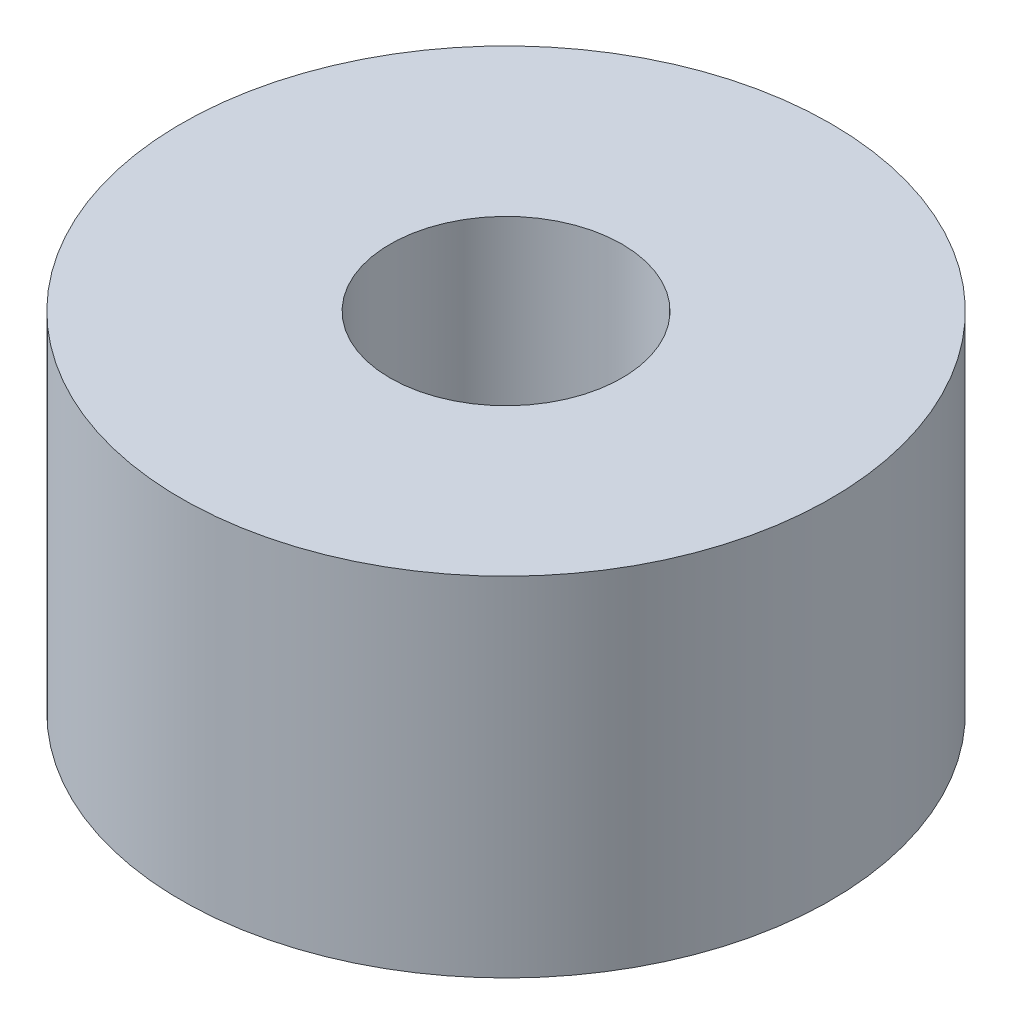
ISO-10303-21;
HEADER;
FILE_DESCRIPTION(('STEP AP214'),'2;1');
FILE_NAME('part.step','',(''),(''),'','','');
FILE_SCHEMA(('AUTOMOTIVE_DESIGN { 1 0 10303 214 1 1 1 1 }'));
ENDSEC;
DATA;
#1=APPLICATION_CONTEXT('core data for automotive mechanical design processes');
#2=APPLICATION_PROTOCOL_DEFINITION('international standard','automotive_design',2000,#1);
#3=PRODUCT_CONTEXT('',#1,'mechanical');
#4=PRODUCT('Part','Part','',(#3));
#5=PRODUCT_RELATED_PRODUCT_CATEGORY('part','',(#4));
#6=PRODUCT_DEFINITION_FORMATION('','',#4);
#7=PRODUCT_DEFINITION_CONTEXT('part definition',#1,'design');
#8=PRODUCT_DEFINITION('design','',#6,#7);
#9=PRODUCT_DEFINITION_SHAPE('','',#8);
#10=(LENGTH_UNIT() NAMED_UNIT(*) SI_UNIT(.MILLI.,.METRE.));
#11=(NAMED_UNIT(*) PLANE_ANGLE_UNIT() SI_UNIT($,.RADIAN.));
#12=(NAMED_UNIT(*) SI_UNIT($,.STERADIAN.) SOLID_ANGLE_UNIT());
#13=UNCERTAINTY_MEASURE_WITH_UNIT(LENGTH_MEASURE(1.E-05),#10,'distance_accuracy_value','');
#14=(GEOMETRIC_REPRESENTATION_CONTEXT(3) GLOBAL_UNCERTAINTY_ASSIGNED_CONTEXT((#13)) GLOBAL_UNIT_ASSIGNED_CONTEXT((#10,
#11,#12)) REPRESENTATION_CONTEXT('',''));
#15=CARTESIAN_POINT('',(0.,0.,0.));
#16=DIRECTION('',(0.,0.,1.));
#17=DIRECTION('',(1.,0.,0.));
#18=AXIS2_PLACEMENT_3D('',#15,#16,#17);
#19=CARTESIAN_POINT('',(0.,9.525,0.));
#20=DIRECTION('',(0.,1.,0.));
#21=DIRECTION('',(0.,0.,1.));
#22=AXIS2_PLACEMENT_3D('',#19,#20,#21);
#23=PLANE('',#22);
#24=CARTESIAN_POINT('',(0.,9.525,0.));
#25=DIRECTION('',(0.,1.,0.));
#26=DIRECTION('',(0.,0.,1.));
#27=AXIS2_PLACEMENT_3D('',#24,#25,#26);
#28=CIRCLE('',#27,8.89);
#29=CARTESIAN_POINT('',(0.,9.525,-8.89));
#30=VERTEX_POINT('',#29);
#31=EDGE_CURVE('E10',#30,#30,#28,.T.);
#32=ORIENTED_EDGE('',*,*,#31,.T.);
#33=EDGE_LOOP('',(#32));
#34=FACE_BOUND('',#33,.T.);
#35=CARTESIAN_POINT('',(0.,9.525,0.));
#36=DIRECTION('',(0.,1.,0.));
#37=DIRECTION('',(0.,0.,1.));
#38=AXIS2_PLACEMENT_3D('',#35,#36,#37);
#39=CIRCLE('',#38,3.175);
#40=CARTESIAN_POINT('',(0.,9.525,-3.175));
#41=VERTEX_POINT('',#40);
#42=EDGE_CURVE('E50',#41,#41,#39,.T.);
#43=ORIENTED_EDGE('',*,*,#42,.F.);
#44=EDGE_LOOP('',(#43));
#45=FACE_BOUND('',#44,.T.);
#46=ADVANCED_FACE('F37',(#34,#45),#23,.T.);
#47=CARTESIAN_POINT('',(0.,0.,0.));
#48=DIRECTION('',(0.,1.,0.));
#49=DIRECTION('',(0.,0.,1.));
#50=AXIS2_PLACEMENT_3D('',#47,#48,#49);
#51=PLANE('',#50);
#52=CARTESIAN_POINT('',(0.,0.,0.));
#53=DIRECTION('',(0.,1.,0.));
#54=DIRECTION('',(0.,0.,1.));
#55=AXIS2_PLACEMENT_3D('',#52,#53,#54);
#56=CIRCLE('',#55,8.89);
#57=CARTESIAN_POINT('',(0.,0.,-8.89));
#58=VERTEX_POINT('',#57);
#59=EDGE_CURVE('E41',#58,#58,#56,.T.);
#60=ORIENTED_EDGE('',*,*,#59,.F.);
#61=EDGE_LOOP('',(#60));
#62=FACE_BOUND('',#61,.T.);
#63=CARTESIAN_POINT('',(0.,0.,0.));
#64=DIRECTION('',(0.,1.,0.));
#65=DIRECTION('',(0.,0.,1.));
#66=AXIS2_PLACEMENT_3D('',#63,#64,#65);
#67=CIRCLE('',#66,3.175);
#68=CARTESIAN_POINT('',(0.,0.,-3.175));
#69=VERTEX_POINT('',#68);
#70=EDGE_CURVE('E52',#69,#69,#67,.T.);
#71=ORIENTED_EDGE('',*,*,#70,.T.);
#72=EDGE_LOOP('',(#71));
#73=FACE_BOUND('',#72,.T.);
#74=ADVANCED_FACE('F64',(#62,#73),#51,.F.);
#75=CARTESIAN_POINT('',(0.,9.525,0.));
#76=DIRECTION('',(0.,-1.,0.));
#77=DIRECTION('',(0.,0.,-1.));
#78=AXIS2_PLACEMENT_3D('',#75,#76,#77);
#79=CYLINDRICAL_SURFACE('',#78,8.89);
#80=CARTESIAN_POINT('',(0.,9.525,-8.89));
#81=CARTESIAN_POINT('',(0.,9.42578125,-8.89));
#82=CARTESIAN_POINT('',(0.,9.3265625,-8.89));
#83=CARTESIAN_POINT('',(0.,9.128125,-8.89));
#84=CARTESIAN_POINT('',(0.,9.02890625,-8.89));
#85=CARTESIAN_POINT('',(0.,8.83046875,-8.89));
#86=CARTESIAN_POINT('',(0.,8.73125,-8.89));
#87=CARTESIAN_POINT('',(0.,8.5328125,-8.89));
#88=CARTESIAN_POINT('',(0.,8.43359375,-8.89));
#89=CARTESIAN_POINT('',(0.,8.23515625,-8.89));
#90=CARTESIAN_POINT('',(0.,8.1359375,-8.89));
#91=CARTESIAN_POINT('',(0.,7.9375,-8.89));
#92=CARTESIAN_POINT('',(0.,7.83828125,-8.89));
#93=CARTESIAN_POINT('',(0.,7.63984375,-8.89));
#94=CARTESIAN_POINT('',(0.,7.540625,-8.89));
#95=CARTESIAN_POINT('',(0.,7.3421875,-8.89));
#96=CARTESIAN_POINT('',(0.,7.24296875,-8.89));
#97=CARTESIAN_POINT('',(0.,7.04453125,-8.89));
#98=CARTESIAN_POINT('',(0.,6.9453125,-8.89));
#99=CARTESIAN_POINT('',(0.,6.746875,-8.89));
#100=CARTESIAN_POINT('',(0.,6.64765625,-8.89));
#101=CARTESIAN_POINT('',(0.,6.44921875,-8.89));
#102=CARTESIAN_POINT('',(0.,6.35,-8.89));
#103=CARTESIAN_POINT('',(0.,6.1515625,-8.89));
#104=CARTESIAN_POINT('',(0.,6.05234375,-8.89));
#105=CARTESIAN_POINT('',(0.,5.85390625,-8.89));
#106=CARTESIAN_POINT('',(0.,5.7546875,-8.89));
#107=CARTESIAN_POINT('',(0.,5.55625,-8.89));
#108=CARTESIAN_POINT('',(0.,5.45703125,-8.89));
#109=CARTESIAN_POINT('',(0.,5.25859375,-8.89));
#110=CARTESIAN_POINT('',(0.,5.159375,-8.89));
#111=CARTESIAN_POINT('',(0.,4.9609375,-8.89));
#112=CARTESIAN_POINT('',(0.,4.86171875,-8.89));
#113=CARTESIAN_POINT('',(0.,4.66328125,-8.89));
#114=CARTESIAN_POINT('',(0.,4.5640625,-8.89));
#115=CARTESIAN_POINT('',(0.,4.365625,-8.89));
#116=CARTESIAN_POINT('',(0.,4.26640625,-8.89));
#117=CARTESIAN_POINT('',(0.,4.06796875,-8.89));
#118=CARTESIAN_POINT('',(0.,3.96875,-8.89));
#119=CARTESIAN_POINT('',(0.,3.7703125,-8.89));
#120=CARTESIAN_POINT('',(0.,3.67109375,-8.89));
#121=CARTESIAN_POINT('',(0.,3.47265625,-8.89));
#122=CARTESIAN_POINT('',(0.,3.3734375,-8.89));
#123=CARTESIAN_POINT('',(0.,3.175,-8.89));
#124=CARTESIAN_POINT('',(0.,3.07578125,-8.89));
#125=CARTESIAN_POINT('',(0.,2.87734375,-8.89));
#126=CARTESIAN_POINT('',(0.,2.778125,-8.89));
#127=CARTESIAN_POINT('',(0.,2.5796875,-8.89));
#128=CARTESIAN_POINT('',(0.,2.48046875,-8.89));
#129=CARTESIAN_POINT('',(0.,2.28203125,-8.89));
#130=CARTESIAN_POINT('',(0.,2.1828125,-8.89));
#131=CARTESIAN_POINT('',(0.,1.984375,-8.89));
#132=CARTESIAN_POINT('',(0.,1.88515625,-8.89));
#133=CARTESIAN_POINT('',(0.,1.68671875,-8.89));
#134=CARTESIAN_POINT('',(0.,1.5875,-8.89));
#135=CARTESIAN_POINT('',(0.,1.3890625,-8.89));
#136=CARTESIAN_POINT('',(0.,1.28984375,-8.89));
#137=CARTESIAN_POINT('',(0.,1.09140625,-8.89));
#138=CARTESIAN_POINT('',(0.,0.992187500000001,-8.89));
#139=CARTESIAN_POINT('',(0.,0.793750000000001,-8.89));
#140=CARTESIAN_POINT('',(0.,0.69453125,-8.89));
#141=CARTESIAN_POINT('',(0.,0.49609375,-8.89));
#142=CARTESIAN_POINT('',(0.,0.396875,-8.89));
#143=CARTESIAN_POINT('',(0.,0.1984375,-8.89));
#144=CARTESIAN_POINT('',(0.,0.0992187500000001,-8.89));
#145=CARTESIAN_POINT('',(0.,0.,-8.89));
#146=B_SPLINE_CURVE_WITH_KNOTS('',3,(#80,#81,#82,#83,#84,#85,#86,#87,#88,#89,#90,#91,#92,#93,
#94,#95,#96,#97,#98,#99,#100,#101,#102,#103,#104,#105,#106,#107,#108,#109,#110,#111,#112,#113,
#114,#115,#116,#117,#118,#119,#120,#121,#122,#123,#124,#125,#126,#127,#128,#129,#130,#131,#132,
#133,#134,#135,#136,#137,#138,#139,#140,#141,#142,#143,#144,#145),.UNSPECIFIED.,.F.,.F.,(4,2,2,
2,2,2,2,2,2,2,2,2,2,2,2,2,2,2,2,2,2,2,2,2,2,2,2,2,2,2,2,2,4),(0.,0.297656249999998,
0.595312499999999,0.892968749999999,1.190625,1.48828125,1.7859375,2.08359375,2.38125,2.67890625,
2.9765625,3.27421875,3.571875,3.86953125,4.1671875,4.46484375,4.7625,5.06015625,5.3578125,
5.65546875,5.953125,6.25078125,6.5484375,6.84609375,7.14375,7.44140625,7.7390625,8.03671875,
8.334375,8.63203125,8.9296875,9.22734375,9.525),.UNSPECIFIED.);
#147=EDGE_CURVE('BSEAM39',#30,#58,#146,.T.);
#148=ORIENTED_EDGE('',*,*,#31,.F.);
#149=ORIENTED_EDGE('',*,*,#59,.T.);
#150=ORIENTED_EDGE('',*,*,#147,.T.);
#151=ORIENTED_EDGE('',*,*,#147,.F.);
#152=EDGE_LOOP('',(#148,#150,#149,#151));
#153=FACE_BOUND('',#152,.T.);
#154=ADVANCED_FACE('F39',(#153),#79,.T.);
#155=CARTESIAN_POINT('',(0.,9.525,0.));
#156=DIRECTION('',(0.,-1.,0.));
#157=DIRECTION('',(0.,0.,-1.));
#158=AXIS2_PLACEMENT_3D('',#155,#156,#157);
#159=CYLINDRICAL_SURFACE('',#158,3.175);
#160=CARTESIAN_POINT('',(0.,9.525,-3.175));
#161=CARTESIAN_POINT('',(0.,9.42578125,-3.175));
#162=CARTESIAN_POINT('',(0.,9.3265625,-3.175));
#163=CARTESIAN_POINT('',(0.,9.128125,-3.175));
#164=CARTESIAN_POINT('',(0.,9.02890625,-3.175));
#165=CARTESIAN_POINT('',(0.,8.83046875,-3.175));
#166=CARTESIAN_POINT('',(0.,8.73125,-3.175));
#167=CARTESIAN_POINT('',(0.,8.5328125,-3.175));
#168=CARTESIAN_POINT('',(0.,8.43359375,-3.175));
#169=CARTESIAN_POINT('',(0.,8.23515625,-3.175));
#170=CARTESIAN_POINT('',(0.,8.1359375,-3.175));
#171=CARTESIAN_POINT('',(0.,7.9375,-3.175));
#172=CARTESIAN_POINT('',(0.,7.83828125,-3.175));
#173=CARTESIAN_POINT('',(0.,7.63984375,-3.175));
#174=CARTESIAN_POINT('',(0.,7.540625,-3.175));
#175=CARTESIAN_POINT('',(0.,7.3421875,-3.175));
#176=CARTESIAN_POINT('',(0.,7.24296875,-3.175));
#177=CARTESIAN_POINT('',(0.,7.04453125,-3.175));
#178=CARTESIAN_POINT('',(0.,6.9453125,-3.175));
#179=CARTESIAN_POINT('',(0.,6.746875,-3.175));
#180=CARTESIAN_POINT('',(0.,6.64765625,-3.175));
#181=CARTESIAN_POINT('',(0.,6.44921875,-3.175));
#182=CARTESIAN_POINT('',(0.,6.35,-3.175));
#183=CARTESIAN_POINT('',(0.,6.1515625,-3.175));
#184=CARTESIAN_POINT('',(0.,6.05234375,-3.175));
#185=CARTESIAN_POINT('',(0.,5.85390625,-3.175));
#186=CARTESIAN_POINT('',(0.,5.7546875,-3.175));
#187=CARTESIAN_POINT('',(0.,5.55625,-3.175));
#188=CARTESIAN_POINT('',(0.,5.45703125,-3.175));
#189=CARTESIAN_POINT('',(0.,5.25859375,-3.175));
#190=CARTESIAN_POINT('',(0.,5.159375,-3.175));
#191=CARTESIAN_POINT('',(0.,4.9609375,-3.175));
#192=CARTESIAN_POINT('',(0.,4.86171875,-3.175));
#193=CARTESIAN_POINT('',(0.,4.66328125,-3.175));
#194=CARTESIAN_POINT('',(0.,4.5640625,-3.175));
#195=CARTESIAN_POINT('',(0.,4.365625,-3.175));
#196=CARTESIAN_POINT('',(0.,4.26640625,-3.175));
#197=CARTESIAN_POINT('',(0.,4.06796875,-3.175));
#198=CARTESIAN_POINT('',(0.,3.96875,-3.175));
#199=CARTESIAN_POINT('',(0.,3.7703125,-3.175));
#200=CARTESIAN_POINT('',(0.,3.67109375,-3.175));
#201=CARTESIAN_POINT('',(0.,3.47265625,-3.175));
#202=CARTESIAN_POINT('',(0.,3.3734375,-3.175));
#203=CARTESIAN_POINT('',(0.,3.175,-3.175));
#204=CARTESIAN_POINT('',(0.,3.07578125,-3.175));
#205=CARTESIAN_POINT('',(0.,2.87734375,-3.175));
#206=CARTESIAN_POINT('',(0.,2.778125,-3.175));
#207=CARTESIAN_POINT('',(0.,2.5796875,-3.175));
#208=CARTESIAN_POINT('',(0.,2.48046875,-3.175));
#209=CARTESIAN_POINT('',(0.,2.28203125,-3.175));
#210=CARTESIAN_POINT('',(0.,2.1828125,-3.175));
#211=CARTESIAN_POINT('',(0.,1.984375,-3.175));
#212=CARTESIAN_POINT('',(0.,1.88515625,-3.175));
#213=CARTESIAN_POINT('',(0.,1.68671875,-3.175));
#214=CARTESIAN_POINT('',(0.,1.5875,-3.175));
#215=CARTESIAN_POINT('',(0.,1.3890625,-3.175));
#216=CARTESIAN_POINT('',(0.,1.28984375,-3.175));
#217=CARTESIAN_POINT('',(0.,1.09140625,-3.175));
#218=CARTESIAN_POINT('',(0.,0.992187500000001,-3.175));
#219=CARTESIAN_POINT('',(0.,0.793750000000001,-3.175));
#220=CARTESIAN_POINT('',(0.,0.69453125,-3.175));
#221=CARTESIAN_POINT('',(0.,0.49609375,-3.175));
#222=CARTESIAN_POINT('',(0.,0.396875,-3.175));
#223=CARTESIAN_POINT('',(0.,0.1984375,-3.175));
#224=CARTESIAN_POINT('',(0.,0.0992187500000001,-3.175));
#225=CARTESIAN_POINT('',(0.,0.,-3.175));
#226=B_SPLINE_CURVE_WITH_KNOTS('',3,(#160,#161,#162,#163,#164,#165,#166,#167,#168,#169,#170,
#171,#172,#173,#174,#175,#176,#177,#178,#179,#180,#181,#182,#183,#184,#185,#186,#187,#188,#189,
#190,#191,#192,#193,#194,#195,#196,#197,#198,#199,#200,#201,#202,#203,#204,#205,#206,#207,#208,
#209,#210,#211,#212,#213,#214,#215,#216,#217,#218,#219,#220,#221,#222,#223,#224,#225),
.UNSPECIFIED.,.F.,.F.,(4,2,2,2,2,2,2,2,2,2,2,2,2,2,2,2,2,2,2,2,2,2,2,2,2,2,2,2,2,2,2,2,4),(0.,
0.29765625,0.5953125,0.892968750000001,1.190625,1.48828125,1.7859375,2.08359375,2.38125,
2.67890625,2.9765625,3.27421875,3.571875,3.86953125,4.1671875,4.46484375,4.7625,5.06015625,
5.3578125,5.65546875,5.953125,6.25078125,6.5484375,6.84609375,7.14375,7.44140625,7.7390625,
8.03671875,8.334375,8.63203125,8.9296875,9.22734375,9.525),.UNSPECIFIED.);
#227=EDGE_CURVE('BSEAM60',#41,#69,#226,.T.);
#228=ORIENTED_EDGE('',*,*,#42,.T.);
#229=ORIENTED_EDGE('',*,*,#70,.F.);
#230=ORIENTED_EDGE('',*,*,#227,.T.);
#231=ORIENTED_EDGE('',*,*,#227,.F.);
#232=EDGE_LOOP('',(#228,#230,#229,#231));
#233=FACE_BOUND('',#232,.T.);
#234=ADVANCED_FACE('F60',(#233),#159,.F.);
#235=CLOSED_SHELL('',(#46,#74,#154,#234));
#236=MANIFOLD_SOLID_BREP('B2',#235);
#237=ADVANCED_BREP_SHAPE_REPRESENTATION('',(#18,#236),#14);
#238=SHAPE_DEFINITION_REPRESENTATION(#9,#237);
ENDSEC;
END-ISO-10303-21;
